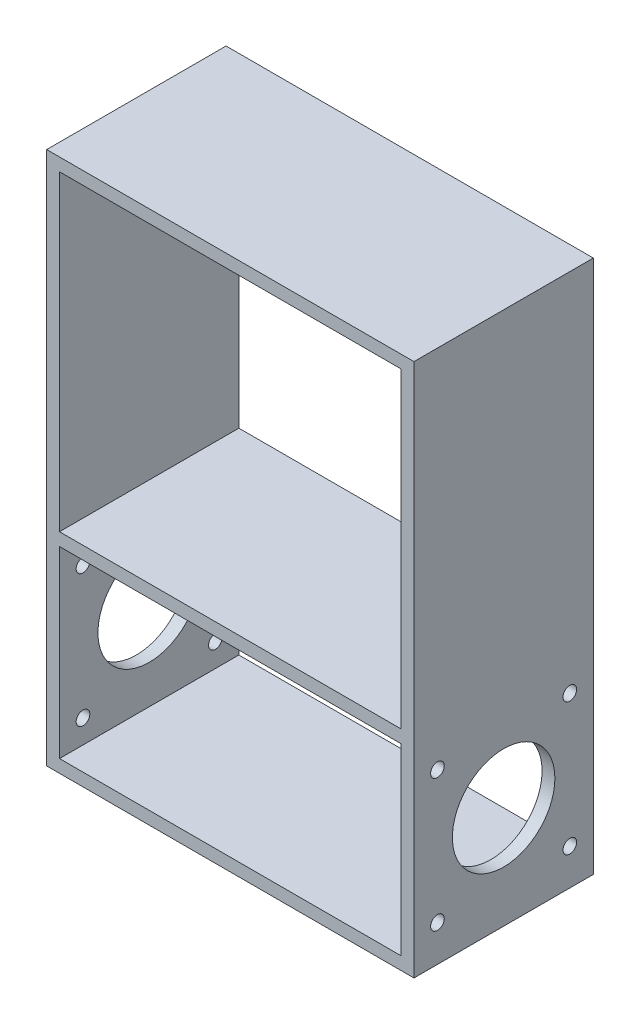
ISO-10303-21;
HEADER;
FILE_DESCRIPTION(('STEP AP214'),'2;1');
FILE_NAME('part.step','',(''),(''),'','','');
FILE_SCHEMA(('AUTOMOTIVE_DESIGN { 1 0 10303 214 1 1 1 1 }'));
ENDSEC;
DATA;
#1=APPLICATION_CONTEXT('core data for automotive mechanical design processes');
#2=APPLICATION_PROTOCOL_DEFINITION('international standard','automotive_design',2000,#1);
#3=PRODUCT_CONTEXT('',#1,'mechanical');
#4=PRODUCT('Part','Part','',(#3));
#5=PRODUCT_RELATED_PRODUCT_CATEGORY('part','',(#4));
#6=PRODUCT_DEFINITION_FORMATION('','',#4);
#7=PRODUCT_DEFINITION_CONTEXT('part definition',#1,'design');
#8=PRODUCT_DEFINITION('design','',#6,#7);
#9=PRODUCT_DEFINITION_SHAPE('','',#8);
#10=(LENGTH_UNIT() NAMED_UNIT(*) SI_UNIT(.MILLI.,.METRE.));
#11=(NAMED_UNIT(*) PLANE_ANGLE_UNIT() SI_UNIT($,.RADIAN.));
#12=(NAMED_UNIT(*) SI_UNIT($,.STERADIAN.) SOLID_ANGLE_UNIT());
#13=UNCERTAINTY_MEASURE_WITH_UNIT(LENGTH_MEASURE(1.E-05),#10,'distance_accuracy_value','');
#14=(GEOMETRIC_REPRESENTATION_CONTEXT(3) GLOBAL_UNCERTAINTY_ASSIGNED_CONTEXT((#13)) GLOBAL_UNIT_ASSIGNED_CONTEXT((#10,
#11,#12)) REPRESENTATION_CONTEXT('',''));
#15=CARTESIAN_POINT('',(0.,0.,0.));
#16=DIRECTION('',(0.,0.,1.));
#17=DIRECTION('',(1.,0.,0.));
#18=AXIS2_PLACEMENT_3D('',#15,#16,#17);
#19=CARTESIAN_POINT('',(0.,0.,0.));
#20=DIRECTION('',(1.,0.,0.));
#21=DIRECTION('',(0.,0.,-1.));
#22=AXIS2_PLACEMENT_3D('',#19,#20,#21);
#23=PLANE('',#22);
#24=CARTESIAN_POINT('',(0.,15.5,-15.5));
#25=DIRECTION('',(1.,0.,0.));
#26=DIRECTION('',(0.,0.,-1.));
#27=AXIS2_PLACEMENT_3D('',#24,#25,#26);
#28=CIRCLE('',#27,1.6);
#29=CARTESIAN_POINT('',(0.,15.5,-17.1));
#30=VERTEX_POINT('',#29);
#31=EDGE_CURVE('E230',#30,#30,#28,.T.);
#32=ORIENTED_EDGE('',*,*,#31,.T.);
#33=EDGE_LOOP('',(#32));
#34=FACE_BOUND('',#33,.T.);
#35=CARTESIAN_POINT('',(0.,-15.5,15.5));
#36=DIRECTION('',(1.,0.,0.));
#37=DIRECTION('',(0.,0.,-1.));
#38=AXIS2_PLACEMENT_3D('',#35,#36,#37);
#39=CIRCLE('',#38,1.6);
#40=CARTESIAN_POINT('',(0.,-15.5,13.9));
#41=VERTEX_POINT('',#40);
#42=EDGE_CURVE('E233',#41,#41,#39,.T.);
#43=ORIENTED_EDGE('',*,*,#42,.T.);
#44=EDGE_LOOP('',(#43));
#45=FACE_BOUND('',#44,.T.);
#46=CARTESIAN_POINT('',(0.,15.5,15.5));
#47=DIRECTION('',(1.,0.,0.));
#48=DIRECTION('',(0.,0.,-1.));
#49=AXIS2_PLACEMENT_3D('',#46,#47,#48);
#50=CIRCLE('',#49,1.6);
#51=CARTESIAN_POINT('',(0.,15.5,13.9));
#52=VERTEX_POINT('',#51);
#53=EDGE_CURVE('E236',#52,#52,#50,.T.);
#54=ORIENTED_EDGE('',*,*,#53,.T.);
#55=EDGE_LOOP('',(#54));
#56=FACE_BOUND('',#55,.T.);
#57=CARTESIAN_POINT('',(0.,-15.5,-15.5));
#58=DIRECTION('',(1.,0.,0.));
#59=DIRECTION('',(0.,0.,-1.));
#60=AXIS2_PLACEMENT_3D('',#57,#58,#59);
#61=CIRCLE('',#60,1.60000000000001);
#62=CARTESIAN_POINT('',(0.,-15.5,-17.1));
#63=VERTEX_POINT('',#62);
#64=EDGE_CURVE('E239',#63,#63,#61,.T.);
#65=ORIENTED_EDGE('',*,*,#64,.T.);
#66=EDGE_LOOP('',(#65));
#67=FACE_BOUND('',#66,.T.);
#68=CARTESIAN_POINT('',(0.,0.,0.));
#69=DIRECTION('',(1.,0.,0.));
#70=DIRECTION('',(0.,0.,-1.));
#71=AXIS2_PLACEMENT_3D('',#68,#69,#70);
#72=CIRCLE('',#71,12.);
#73=CARTESIAN_POINT('',(0.,0.,-12.));
#74=VERTEX_POINT('',#73);
#75=EDGE_CURVE('E202',#74,#74,#72,.T.);
#76=ORIENTED_EDGE('',*,*,#75,.T.);
#77=EDGE_LOOP('',(#76));
#78=FACE_BOUND('',#77,.T.);
#79=DIRECTION('',(0.,1.,0.));
#80=VECTOR('',#79,1.);
#81=CARTESIAN_POINT('',(0.,0.,-21.));
#82=LINE('',#81,#80);
#83=CARTESIAN_POINT('',(0.,-21.,-21.));
#84=VERTEX_POINT('',#83);
#85=CARTESIAN_POINT('',(0.,22.,-21.));
#86=VERTEX_POINT('',#85);
#87=EDGE_CURVE('E228',#84,#86,#82,.T.);
#88=ORIENTED_EDGE('',*,*,#87,.F.);
#89=DIRECTION('',(0.,0.,1.));
#90=VECTOR('',#89,1.);
#91=CARTESIAN_POINT('',(0.,-21.,0.));
#92=LINE('',#91,#90);
#93=CARTESIAN_POINT('',(0.,-21.,21.));
#94=VERTEX_POINT('',#93);
#95=EDGE_CURVE('E52',#84,#94,#92,.T.);
#96=ORIENTED_EDGE('',*,*,#95,.T.);
#97=DIRECTION('',(0.,1.,0.));
#98=VECTOR('',#97,1.);
#99=CARTESIAN_POINT('',(0.,0.,21.));
#100=LINE('',#99,#98);
#101=CARTESIAN_POINT('',(0.,22.,21.));
#102=VERTEX_POINT('',#101);
#103=EDGE_CURVE('E131',#94,#102,#100,.T.);
#104=ORIENTED_EDGE('',*,*,#103,.T.);
#105=DIRECTION('',(0.,0.,1.));
#106=VECTOR('',#105,1.);
#107=CARTESIAN_POINT('',(0.,22.,0.));
#108=LINE('',#107,#106);
#109=EDGE_CURVE('E176',#86,#102,#108,.T.);
#110=ORIENTED_EDGE('',*,*,#109,.F.);
#111=EDGE_LOOP('',(#88,#96,#104,#110));
#112=FACE_BOUND('',#111,.T.);
#113=ADVANCED_FACE('F37',(#34,#45,#56,#67,#78,#112),#23,.F.);
#114=CARTESIAN_POINT('',(0.,25.,-21.));
#115=VERTEX_POINT('',#114);
#116=CARTESIAN_POINT('',(0.,98.,-21.));
#117=VERTEX_POINT('',#116);
#118=EDGE_CURVE('E227',#115,#117,#82,.T.);
#119=ORIENTED_EDGE('',*,*,#118,.F.);
#120=DIRECTION('',(0.,0.,1.));
#121=VECTOR('',#120,1.);
#122=CARTESIAN_POINT('',(0.,25.,0.));
#123=LINE('',#122,#121);
#124=CARTESIAN_POINT('',(0.,25.,21.));
#125=VERTEX_POINT('',#124);
#126=EDGE_CURVE('E60',#115,#125,#123,.T.);
#127=ORIENTED_EDGE('',*,*,#126,.T.);
#128=CARTESIAN_POINT('',(0.,98.,21.));
#129=VERTEX_POINT('',#128);
#130=EDGE_CURVE('E197',#125,#129,#100,.T.);
#131=ORIENTED_EDGE('',*,*,#130,.T.);
#132=DIRECTION('',(0.,0.,1.));
#133=VECTOR('',#132,1.);
#134=CARTESIAN_POINT('',(0.,98.,0.));
#135=LINE('',#134,#133);
#136=EDGE_CURVE('E188',#117,#129,#135,.T.);
#137=ORIENTED_EDGE('',*,*,#136,.F.);
#138=EDGE_LOOP('',(#119,#127,#131,#137));
#139=FACE_BOUND('',#138,.T.);
#140=ADVANCED_FACE('F312',(#139),#23,.F.);
#141=CARTESIAN_POINT('',(3.,0.,21.));
#142=DIRECTION('',(0.,0.,1.));
#143=DIRECTION('',(1.,0.,0.));
#144=AXIS2_PLACEMENT_3D('',#141,#142,#143);
#145=PLANE('',#144);
#146=DIRECTION('',(-1.,0.,0.));
#147=VECTOR('',#146,1.);
#148=CARTESIAN_POINT('',(3.,101.,21.));
#149=LINE('',#148,#147);
#150=CARTESIAN_POINT('',(3.,101.,21.));
#151=VERTEX_POINT('',#150);
#152=CARTESIAN_POINT('',(-83.,101.,21.));
#153=VERTEX_POINT('',#152);
#154=EDGE_CURVE('E225',#151,#153,#149,.T.);
#155=ORIENTED_EDGE('',*,*,#154,.T.);
#156=DIRECTION('',(0.,1.,0.));
#157=VECTOR('',#156,1.);
#158=CARTESIAN_POINT('',(-83.,0.,21.));
#159=LINE('',#158,#157);
#160=CARTESIAN_POINT('',(-83.,-24.,21.));
#161=VERTEX_POINT('',#160);
#162=EDGE_CURVE('E172',#161,#153,#159,.T.);
#163=ORIENTED_EDGE('',*,*,#162,.F.);
#164=DIRECTION('',(-1.,0.,0.));
#165=VECTOR('',#164,1.);
#166=CARTESIAN_POINT('',(3.,-24.,21.));
#167=LINE('',#166,#165);
#168=CARTESIAN_POINT('',(3.,-24.,21.));
#169=VERTEX_POINT('',#168);
#170=EDGE_CURVE('E11',#169,#161,#167,.T.);
#171=ORIENTED_EDGE('',*,*,#170,.F.);
#172=DIRECTION('',(0.,1.,0.));
#173=VECTOR('',#172,1.);
#174=CARTESIAN_POINT('',(3.,0.,21.));
#175=LINE('',#174,#173);
#176=EDGE_CURVE('E198',#169,#151,#175,.T.);
#177=ORIENTED_EDGE('',*,*,#176,.T.);
#178=EDGE_LOOP('',(#155,#163,#171,#177));
#179=FACE_BOUND('',#178,.T.);
#180=DIRECTION('',(1.,0.,0.));
#181=VECTOR('',#180,1.);
#182=CARTESIAN_POINT('',(-40.,25.,21.));
#183=LINE('',#182,#181);
#184=CARTESIAN_POINT('',(-80.,25.,21.));
#185=VERTEX_POINT('',#184);
#186=EDGE_CURVE('E179',#185,#125,#183,.T.);
#187=ORIENTED_EDGE('',*,*,#186,.F.);
#188=DIRECTION('',(0.,1.,0.));
#189=VECTOR('',#188,1.);
#190=CARTESIAN_POINT('',(-80.,0.,21.));
#191=LINE('',#190,#189);
#192=CARTESIAN_POINT('',(-80.,98.,21.));
#193=VERTEX_POINT('',#192);
#194=EDGE_CURVE('E146',#185,#193,#191,.T.);
#195=ORIENTED_EDGE('',*,*,#194,.T.);
#196=DIRECTION('',(1.,0.,0.));
#197=VECTOR('',#196,1.);
#198=CARTESIAN_POINT('',(-40.,98.,21.));
#199=LINE('',#198,#197);
#200=EDGE_CURVE('E191',#193,#129,#199,.T.);
#201=ORIENTED_EDGE('',*,*,#200,.T.);
#202=ORIENTED_EDGE('',*,*,#130,.F.);
#203=EDGE_LOOP('',(#187,#195,#201,#202));
#204=FACE_BOUND('',#203,.T.);
#205=ORIENTED_EDGE('',*,*,#103,.F.);
#206=DIRECTION('',(1.,0.,0.));
#207=VECTOR('',#206,1.);
#208=CARTESIAN_POINT('',(-40.,-21.,21.));
#209=LINE('',#208,#207);
#210=CARTESIAN_POINT('',(-80.,-21.,21.));
#211=VERTEX_POINT('',#210);
#212=EDGE_CURVE('E125',#211,#94,#209,.T.);
#213=ORIENTED_EDGE('',*,*,#212,.F.);
#214=CARTESIAN_POINT('',(-80.,22.,21.));
#215=VERTEX_POINT('',#214);
#216=EDGE_CURVE('E129',#211,#215,#191,.T.);
#217=ORIENTED_EDGE('',*,*,#216,.T.);
#218=DIRECTION('',(1.,0.,0.));
#219=VECTOR('',#218,1.);
#220=CARTESIAN_POINT('',(-40.,22.,21.));
#221=LINE('',#220,#219);
#222=EDGE_CURVE('E181',#215,#102,#221,.T.);
#223=ORIENTED_EDGE('',*,*,#222,.T.);
#224=EDGE_LOOP('',(#205,#213,#217,#223));
#225=FACE_BOUND('',#224,.T.);
#226=ADVANCED_FACE('F39',(#179,#204,#225),#145,.T.);
#227=CARTESIAN_POINT('',(3.,-24.,0.));
#228=DIRECTION('',(0.,-1.,0.));
#229=DIRECTION('',(0.,0.,-1.));
#230=AXIS2_PLACEMENT_3D('',#227,#228,#229);
#231=PLANE('',#230);
#232=ORIENTED_EDGE('',*,*,#170,.T.);
#233=DIRECTION('',(0.,0.,1.));
#234=VECTOR('',#233,1.);
#235=CARTESIAN_POINT('',(-83.,-24.,0.));
#236=LINE('',#235,#234);
#237=CARTESIAN_POINT('',(-83.,-24.,-21.));
#238=VERTEX_POINT('',#237);
#239=EDGE_CURVE('E262',#238,#161,#236,.T.);
#240=ORIENTED_EDGE('',*,*,#239,.F.);
#241=DIRECTION('',(-1.,0.,0.));
#242=VECTOR('',#241,1.);
#243=CARTESIAN_POINT('',(3.,-24.,-21.));
#244=LINE('',#243,#242);
#245=CARTESIAN_POINT('',(3.,-24.,-21.));
#246=VERTEX_POINT('',#245);
#247=EDGE_CURVE('E45',#246,#238,#244,.T.);
#248=ORIENTED_EDGE('',*,*,#247,.F.);
#249=DIRECTION('',(0.,0.,1.));
#250=VECTOR('',#249,1.);
#251=CARTESIAN_POINT('',(3.,-24.,0.));
#252=LINE('',#251,#250);
#253=EDGE_CURVE('E201',#246,#169,#252,.T.);
#254=ORIENTED_EDGE('',*,*,#253,.T.);
#255=EDGE_LOOP('',(#232,#240,#248,#254));
#256=FACE_BOUND('',#255,.T.);
#257=ADVANCED_FACE('F267',(#256),#231,.T.);
#258=CARTESIAN_POINT('',(3.,0.,-21.));
#259=DIRECTION('',(0.,0.,1.));
#260=DIRECTION('',(0.,-1.,0.));
#261=AXIS2_PLACEMENT_3D('',#258,#259,#260);
#262=PLANE('',#261);
#263=DIRECTION('',(1.,0.,0.));
#264=VECTOR('',#263,1.);
#265=CARTESIAN_POINT('',(-40.,98.,-21.));
#266=LINE('',#265,#264);
#267=CARTESIAN_POINT('',(-80.,98.,-21.));
#268=VERTEX_POINT('',#267);
#269=EDGE_CURVE('E194',#268,#117,#266,.T.);
#270=ORIENTED_EDGE('',*,*,#269,.F.);
#271=DIRECTION('',(0.,1.,0.));
#272=VECTOR('',#271,1.);
#273=CARTESIAN_POINT('',(-80.,0.,-21.));
#274=LINE('',#273,#272);
#275=CARTESIAN_POINT('',(-80.,25.,-21.));
#276=VERTEX_POINT('',#275);
#277=EDGE_CURVE('E145',#276,#268,#274,.T.);
#278=ORIENTED_EDGE('',*,*,#277,.F.);
#279=DIRECTION('',(1.,0.,0.));
#280=VECTOR('',#279,1.);
#281=CARTESIAN_POINT('',(-40.,25.,-21.));
#282=LINE('',#281,#280);
#283=EDGE_CURVE('E186',#276,#115,#282,.T.);
#284=ORIENTED_EDGE('',*,*,#283,.T.);
#285=ORIENTED_EDGE('',*,*,#118,.T.);
#286=EDGE_LOOP('',(#270,#278,#284,#285));
#287=FACE_BOUND('',#286,.T.);
#288=DIRECTION('',(1.,0.,0.));
#289=VECTOR('',#288,1.);
#290=CARTESIAN_POINT('',(-40.,22.,-21.));
#291=LINE('',#290,#289);
#292=CARTESIAN_POINT('',(-80.,22.,-21.));
#293=VERTEX_POINT('',#292);
#294=EDGE_CURVE('E183',#293,#86,#291,.T.);
#295=ORIENTED_EDGE('',*,*,#294,.F.);
#296=CARTESIAN_POINT('',(-80.,-21.,-21.));
#297=VERTEX_POINT('',#296);
#298=EDGE_CURVE('E149',#297,#293,#274,.T.);
#299=ORIENTED_EDGE('',*,*,#298,.F.);
#300=DIRECTION('',(1.,0.,0.));
#301=VECTOR('',#300,1.);
#302=CARTESIAN_POINT('',(-40.,-21.,-21.));
#303=LINE('',#302,#301);
#304=EDGE_CURVE('E132',#297,#84,#303,.T.);
#305=ORIENTED_EDGE('',*,*,#304,.T.);
#306=ORIENTED_EDGE('',*,*,#87,.T.);
#307=EDGE_LOOP('',(#295,#299,#305,#306));
#308=FACE_BOUND('',#307,.T.);
#309=ORIENTED_EDGE('',*,*,#247,.T.);
#310=DIRECTION('',(0.,1.,0.));
#311=VECTOR('',#310,1.);
#312=CARTESIAN_POINT('',(-83.,0.,-21.));
#313=LINE('',#312,#311);
#314=CARTESIAN_POINT('',(-83.,101.,-21.));
#315=VERTEX_POINT('',#314);
#316=EDGE_CURVE('E252',#238,#315,#313,.T.);
#317=ORIENTED_EDGE('',*,*,#316,.T.);
#318=DIRECTION('',(-1.,0.,0.));
#319=VECTOR('',#318,1.);
#320=CARTESIAN_POINT('',(3.,101.,-21.));
#321=LINE('',#320,#319);
#322=CARTESIAN_POINT('',(3.,101.,-21.));
#323=VERTEX_POINT('',#322);
#324=EDGE_CURVE('E245',#323,#315,#321,.T.);
#325=ORIENTED_EDGE('',*,*,#324,.F.);
#326=DIRECTION('',(0.,1.,0.));
#327=VECTOR('',#326,1.);
#328=CARTESIAN_POINT('',(3.,0.,-21.));
#329=LINE('',#328,#327);
#330=EDGE_CURVE('E205',#246,#323,#329,.T.);
#331=ORIENTED_EDGE('',*,*,#330,.F.);
#332=EDGE_LOOP('',(#309,#317,#325,#331));
#333=FACE_BOUND('',#332,.T.);
#334=ADVANCED_FACE('F250',(#287,#308,#333),#262,.F.);
#335=CARTESIAN_POINT('',(3.,-15.5,-15.5));
#336=DIRECTION('',(-1.,0.,0.));
#337=DIRECTION('',(0.,0.,1.));
#338=AXIS2_PLACEMENT_3D('',#335,#336,#337);
#339=CYLINDRICAL_SURFACE('',#338,1.60000000000001);
#340=CARTESIAN_POINT('',(3.,-15.5,-15.5));
#341=DIRECTION('',(1.,0.,0.));
#342=DIRECTION('',(0.,0.,-1.));
#343=AXIS2_PLACEMENT_3D('',#340,#341,#342);
#344=CIRCLE('',#343,1.60000000000001);
#345=CARTESIAN_POINT('',(3.,-15.5,-17.1));
#346=VERTEX_POINT('',#345);
#347=EDGE_CURVE('E219',#346,#346,#344,.T.);
#348=ORIENTED_EDGE('',*,*,#347,.T.);
#349=EDGE_LOOP('',(#348));
#350=FACE_BOUND('',#349,.T.);
#351=ORIENTED_EDGE('',*,*,#64,.F.);
#352=EDGE_LOOP('',(#351));
#353=FACE_BOUND('',#352,.T.);
#354=ADVANCED_FACE('F329',(#350,#353),#339,.F.);
#355=CARTESIAN_POINT('',(3.,15.5,15.5));
#356=DIRECTION('',(-1.,0.,0.));
#357=DIRECTION('',(0.,0.,1.));
#358=AXIS2_PLACEMENT_3D('',#355,#356,#357);
#359=CYLINDRICAL_SURFACE('',#358,1.6);
#360=CARTESIAN_POINT('',(3.,15.5,15.5));
#361=DIRECTION('',(1.,0.,0.));
#362=DIRECTION('',(0.,0.,-1.));
#363=AXIS2_PLACEMENT_3D('',#360,#361,#362);
#364=CIRCLE('',#363,1.6);
#365=CARTESIAN_POINT('',(3.,15.5,13.9));
#366=VERTEX_POINT('',#365);
#367=EDGE_CURVE('E216',#366,#366,#364,.T.);
#368=ORIENTED_EDGE('',*,*,#367,.T.);
#369=EDGE_LOOP('',(#368));
#370=FACE_BOUND('',#369,.T.);
#371=ORIENTED_EDGE('',*,*,#53,.F.);
#372=EDGE_LOOP('',(#371));
#373=FACE_BOUND('',#372,.T.);
#374=ADVANCED_FACE('F332',(#370,#373),#359,.F.);
#375=CARTESIAN_POINT('',(3.,-15.5,15.5));
#376=DIRECTION('',(-1.,0.,0.));
#377=DIRECTION('',(0.,0.,1.));
#378=AXIS2_PLACEMENT_3D('',#375,#376,#377);
#379=CYLINDRICAL_SURFACE('',#378,1.6);
#380=CARTESIAN_POINT('',(3.,-15.5,15.5));
#381=DIRECTION('',(1.,0.,0.));
#382=DIRECTION('',(0.,0.,-1.));
#383=AXIS2_PLACEMENT_3D('',#380,#381,#382);
#384=CIRCLE('',#383,1.6);
#385=CARTESIAN_POINT('',(3.,-15.5,13.9));
#386=VERTEX_POINT('',#385);
#387=EDGE_CURVE('E213',#386,#386,#384,.T.);
#388=ORIENTED_EDGE('',*,*,#387,.T.);
#389=EDGE_LOOP('',(#388));
#390=FACE_BOUND('',#389,.T.);
#391=ORIENTED_EDGE('',*,*,#42,.F.);
#392=EDGE_LOOP('',(#391));
#393=FACE_BOUND('',#392,.T.);
#394=ADVANCED_FACE('F336',(#390,#393),#379,.F.);
#395=CARTESIAN_POINT('',(3.,15.5,-15.5));
#396=DIRECTION('',(-1.,0.,0.));
#397=DIRECTION('',(0.,0.,1.));
#398=AXIS2_PLACEMENT_3D('',#395,#396,#397);
#399=CYLINDRICAL_SURFACE('',#398,1.6);
#400=CARTESIAN_POINT('',(3.,15.5,-15.5));
#401=DIRECTION('',(1.,0.,0.));
#402=DIRECTION('',(0.,0.,-1.));
#403=AXIS2_PLACEMENT_3D('',#400,#401,#402);
#404=CIRCLE('',#403,1.6);
#405=CARTESIAN_POINT('',(3.,15.5,-17.1));
#406=VERTEX_POINT('',#405);
#407=EDGE_CURVE('E210',#406,#406,#404,.T.);
#408=ORIENTED_EDGE('',*,*,#407,.T.);
#409=EDGE_LOOP('',(#408));
#410=FACE_BOUND('',#409,.T.);
#411=ORIENTED_EDGE('',*,*,#31,.F.);
#412=EDGE_LOOP('',(#411));
#413=FACE_BOUND('',#412,.T.);
#414=ADVANCED_FACE('F340',(#410,#413),#399,.F.);
#415=CARTESIAN_POINT('',(3.,101.,0.));
#416=DIRECTION('',(0.,1.,0.));
#417=DIRECTION('',(0.,0.,1.));
#418=AXIS2_PLACEMENT_3D('',#415,#416,#417);
#419=PLANE('',#418);
#420=ORIENTED_EDGE('',*,*,#324,.T.);
#421=DIRECTION('',(0.,0.,-1.));
#422=VECTOR('',#421,1.);
#423=CARTESIAN_POINT('',(-83.,101.,0.));
#424=LINE('',#423,#422);
#425=EDGE_CURVE('E265',#153,#315,#424,.T.);
#426=ORIENTED_EDGE('',*,*,#425,.F.);
#427=ORIENTED_EDGE('',*,*,#154,.F.);
#428=DIRECTION('',(0.,0.,-1.));
#429=VECTOR('',#428,1.);
#430=CARTESIAN_POINT('',(3.,101.,0.));
#431=LINE('',#430,#429);
#432=EDGE_CURVE('E207',#151,#323,#431,.T.);
#433=ORIENTED_EDGE('',*,*,#432,.T.);
#434=EDGE_LOOP('',(#420,#426,#427,#433));
#435=FACE_BOUND('',#434,.T.);
#436=ADVANCED_FACE('F327',(#435),#419,.T.);
#437=CARTESIAN_POINT('',(3.,0.,0.));
#438=DIRECTION('',(-1.,0.,0.));
#439=DIRECTION('',(0.,0.,1.));
#440=AXIS2_PLACEMENT_3D('',#437,#438,#439);
#441=CYLINDRICAL_SURFACE('',#440,12.);
#442=CARTESIAN_POINT('',(3.,0.,0.));
#443=DIRECTION('',(1.,0.,0.));
#444=DIRECTION('',(0.,0.,-1.));
#445=AXIS2_PLACEMENT_3D('',#442,#443,#444);
#446=CIRCLE('',#445,12.);
#447=CARTESIAN_POINT('',(3.,0.,-12.));
#448=VERTEX_POINT('',#447);
#449=EDGE_CURVE('E222',#448,#448,#446,.T.);
#450=ORIENTED_EDGE('',*,*,#449,.T.);
#451=EDGE_LOOP('',(#450));
#452=FACE_BOUND('',#451,.T.);
#453=ORIENTED_EDGE('',*,*,#75,.F.);
#454=EDGE_LOOP('',(#453));
#455=FACE_BOUND('',#454,.T.);
#456=ADVANCED_FACE('F324',(#452,#455),#441,.F.);
#457=CARTESIAN_POINT('',(3.,0.,0.));
#458=DIRECTION('',(1.,0.,0.));
#459=DIRECTION('',(0.,0.,-1.));
#460=AXIS2_PLACEMENT_3D('',#457,#458,#459);
#461=PLANE('',#460);
#462=ORIENTED_EDGE('',*,*,#176,.F.);
#463=ORIENTED_EDGE('',*,*,#253,.F.);
#464=ORIENTED_EDGE('',*,*,#330,.T.);
#465=ORIENTED_EDGE('',*,*,#432,.F.);
#466=EDGE_LOOP('',(#462,#463,#464,#465));
#467=FACE_BOUND('',#466,.T.);
#468=ORIENTED_EDGE('',*,*,#407,.F.);
#469=EDGE_LOOP('',(#468));
#470=FACE_BOUND('',#469,.T.);
#471=ORIENTED_EDGE('',*,*,#387,.F.);
#472=EDGE_LOOP('',(#471));
#473=FACE_BOUND('',#472,.T.);
#474=ORIENTED_EDGE('',*,*,#367,.F.);
#475=EDGE_LOOP('',(#474));
#476=FACE_BOUND('',#475,.T.);
#477=ORIENTED_EDGE('',*,*,#347,.F.);
#478=EDGE_LOOP('',(#477));
#479=FACE_BOUND('',#478,.T.);
#480=ORIENTED_EDGE('',*,*,#449,.F.);
#481=EDGE_LOOP('',(#480));
#482=FACE_BOUND('',#481,.T.);
#483=ADVANCED_FACE('F322',(#467,#470,#473,#476,#479,#482),#461,.T.);
#484=CARTESIAN_POINT('',(-40.,98.,0.));
#485=DIRECTION('',(0.,1.,0.));
#486=DIRECTION('',(0.,0.,1.));
#487=AXIS2_PLACEMENT_3D('',#484,#485,#486);
#488=PLANE('',#487);
#489=ORIENTED_EDGE('',*,*,#136,.T.);
#490=ORIENTED_EDGE('',*,*,#200,.F.);
#491=DIRECTION('',(0.,0.,1.));
#492=VECTOR('',#491,1.);
#493=CARTESIAN_POINT('',(-80.,98.,0.));
#494=LINE('',#493,#492);
#495=EDGE_CURVE('E152',#268,#193,#494,.T.);
#496=ORIENTED_EDGE('',*,*,#495,.F.);
#497=ORIENTED_EDGE('',*,*,#269,.T.);
#498=EDGE_LOOP('',(#489,#490,#496,#497));
#499=FACE_BOUND('',#498,.T.);
#500=ADVANCED_FACE('F369',(#499),#488,.F.);
#501=CARTESIAN_POINT('',(-40.,25.,0.));
#502=DIRECTION('',(0.,1.,0.));
#503=DIRECTION('',(0.,0.,1.));
#504=AXIS2_PLACEMENT_3D('',#501,#502,#503);
#505=PLANE('',#504);
#506=ORIENTED_EDGE('',*,*,#126,.F.);
#507=ORIENTED_EDGE('',*,*,#283,.F.);
#508=DIRECTION('',(0.,0.,1.));
#509=VECTOR('',#508,1.);
#510=CARTESIAN_POINT('',(-80.,25.,0.));
#511=LINE('',#510,#509);
#512=EDGE_CURVE('E140',#276,#185,#511,.T.);
#513=ORIENTED_EDGE('',*,*,#512,.T.);
#514=ORIENTED_EDGE('',*,*,#186,.T.);
#515=EDGE_LOOP('',(#506,#507,#513,#514));
#516=FACE_BOUND('',#515,.T.);
#517=ADVANCED_FACE('F363',(#516),#505,.T.);
#518=CARTESIAN_POINT('',(-40.,22.,0.));
#519=DIRECTION('',(0.,1.,0.));
#520=DIRECTION('',(0.,0.,1.));
#521=AXIS2_PLACEMENT_3D('',#518,#519,#520);
#522=PLANE('',#521);
#523=ORIENTED_EDGE('',*,*,#109,.T.);
#524=ORIENTED_EDGE('',*,*,#222,.F.);
#525=DIRECTION('',(0.,0.,1.));
#526=VECTOR('',#525,1.);
#527=CARTESIAN_POINT('',(-80.,22.,0.));
#528=LINE('',#527,#526);
#529=EDGE_CURVE('E144',#293,#215,#528,.T.);
#530=ORIENTED_EDGE('',*,*,#529,.F.);
#531=ORIENTED_EDGE('',*,*,#294,.T.);
#532=EDGE_LOOP('',(#523,#524,#530,#531));
#533=FACE_BOUND('',#532,.T.);
#534=ADVANCED_FACE('F306',(#533),#522,.F.);
#535=CARTESIAN_POINT('',(-40.,-21.,0.));
#536=DIRECTION('',(0.,1.,0.));
#537=DIRECTION('',(0.,0.,1.));
#538=AXIS2_PLACEMENT_3D('',#535,#536,#537);
#539=PLANE('',#538);
#540=ORIENTED_EDGE('',*,*,#95,.F.);
#541=ORIENTED_EDGE('',*,*,#304,.F.);
#542=DIRECTION('',(0.,0.,1.));
#543=VECTOR('',#542,1.);
#544=CARTESIAN_POINT('',(-80.,-21.,0.));
#545=LINE('',#544,#543);
#546=EDGE_CURVE('E135',#297,#211,#545,.T.);
#547=ORIENTED_EDGE('',*,*,#546,.T.);
#548=ORIENTED_EDGE('',*,*,#212,.T.);
#549=EDGE_LOOP('',(#540,#541,#547,#548));
#550=FACE_BOUND('',#549,.T.);
#551=ADVANCED_FACE('F136',(#550),#539,.T.);
#552=CARTESIAN_POINT('',(-80.,0.,0.));
#553=DIRECTION('',(-1.,0.,0.));
#554=DIRECTION('',(0.,0.,-1.));
#555=AXIS2_PLACEMENT_3D('',#552,#553,#554);
#556=PLANE('',#555);
#557=CARTESIAN_POINT('',(-80.,15.5,-15.5));
#558=DIRECTION('',(1.,0.,0.));
#559=DIRECTION('',(0.,0.,-1.));
#560=AXIS2_PLACEMENT_3D('',#557,#558,#559);
#561=CIRCLE('',#560,1.6);
#562=CARTESIAN_POINT('',(-80.,15.5,-17.1));
#563=VERTEX_POINT('',#562);
#564=EDGE_CURVE('E157',#563,#563,#561,.T.);
#565=ORIENTED_EDGE('',*,*,#564,.F.);
#566=EDGE_LOOP('',(#565));
#567=FACE_BOUND('',#566,.T.);
#568=CARTESIAN_POINT('',(-80.,-15.5,15.5));
#569=DIRECTION('',(1.,0.,0.));
#570=DIRECTION('',(0.,0.,-1.));
#571=AXIS2_PLACEMENT_3D('',#568,#569,#570);
#572=CIRCLE('',#571,1.6);
#573=CARTESIAN_POINT('',(-80.,-15.5,13.9));
#574=VERTEX_POINT('',#573);
#575=EDGE_CURVE('E160',#574,#574,#572,.T.);
#576=ORIENTED_EDGE('',*,*,#575,.F.);
#577=EDGE_LOOP('',(#576));
#578=FACE_BOUND('',#577,.T.);
#579=CARTESIAN_POINT('',(-80.,15.5,15.5));
#580=DIRECTION('',(1.,0.,0.));
#581=DIRECTION('',(0.,0.,-1.));
#582=AXIS2_PLACEMENT_3D('',#579,#580,#581);
#583=CIRCLE('',#582,1.6);
#584=CARTESIAN_POINT('',(-80.,15.5,13.9));
#585=VERTEX_POINT('',#584);
#586=EDGE_CURVE('E163',#585,#585,#583,.T.);
#587=ORIENTED_EDGE('',*,*,#586,.F.);
#588=EDGE_LOOP('',(#587));
#589=FACE_BOUND('',#588,.T.);
#590=CARTESIAN_POINT('',(-80.,-15.5,-15.5));
#591=DIRECTION('',(1.,0.,0.));
#592=DIRECTION('',(0.,0.,-1.));
#593=AXIS2_PLACEMENT_3D('',#590,#591,#592);
#594=CIRCLE('',#593,1.60000000000001);
#595=CARTESIAN_POINT('',(-80.,-15.5,-17.1));
#596=VERTEX_POINT('',#595);
#597=EDGE_CURVE('E166',#596,#596,#594,.T.);
#598=ORIENTED_EDGE('',*,*,#597,.F.);
#599=EDGE_LOOP('',(#598));
#600=FACE_BOUND('',#599,.T.);
#601=CARTESIAN_POINT('',(-80.,0.,0.));
#602=DIRECTION('',(1.,0.,0.));
#603=DIRECTION('',(0.,0.,-1.));
#604=AXIS2_PLACEMENT_3D('',#601,#602,#603);
#605=CIRCLE('',#604,12.);
#606=CARTESIAN_POINT('',(-80.,0.,-12.));
#607=VERTEX_POINT('',#606);
#608=EDGE_CURVE('E169',#607,#607,#605,.T.);
#609=ORIENTED_EDGE('',*,*,#608,.F.);
#610=EDGE_LOOP('',(#609));
#611=FACE_BOUND('',#610,.T.);
#612=ORIENTED_EDGE('',*,*,#298,.T.);
#613=ORIENTED_EDGE('',*,*,#529,.T.);
#614=ORIENTED_EDGE('',*,*,#216,.F.);
#615=ORIENTED_EDGE('',*,*,#546,.F.);
#616=EDGE_LOOP('',(#612,#613,#614,#615));
#617=FACE_BOUND('',#616,.T.);
#618=ADVANCED_FACE('F142',(#567,#578,#589,#600,#611,#617),#556,.F.);
#619=ORIENTED_EDGE('',*,*,#277,.T.);
#620=ORIENTED_EDGE('',*,*,#495,.T.);
#621=ORIENTED_EDGE('',*,*,#194,.F.);
#622=ORIENTED_EDGE('',*,*,#512,.F.);
#623=EDGE_LOOP('',(#619,#620,#621,#622));
#624=FACE_BOUND('',#623,.T.);
#625=ADVANCED_FACE('F297',(#624),#556,.F.);
#626=CARTESIAN_POINT('',(-83.,-15.5,-15.5));
#627=DIRECTION('',(1.,0.,0.));
#628=DIRECTION('',(0.,0.,1.));
#629=AXIS2_PLACEMENT_3D('',#626,#627,#628);
#630=CYLINDRICAL_SURFACE('',#629,1.60000000000001);
#631=CARTESIAN_POINT('',(-83.,-15.5,-15.5));
#632=DIRECTION('',(1.,0.,0.));
#633=DIRECTION('',(0.,0.,-1.));
#634=AXIS2_PLACEMENT_3D('',#631,#632,#633);
#635=CIRCLE('',#634,1.60000000000001);
#636=CARTESIAN_POINT('',(-83.,-15.5,-17.1));
#637=VERTEX_POINT('',#636);
#638=EDGE_CURVE('E281',#637,#637,#635,.T.);
#639=ORIENTED_EDGE('',*,*,#638,.F.);
#640=EDGE_LOOP('',(#639));
#641=FACE_BOUND('',#640,.T.);
#642=ORIENTED_EDGE('',*,*,#597,.T.);
#643=EDGE_LOOP('',(#642));
#644=FACE_BOUND('',#643,.T.);
#645=ADVANCED_FACE('F304',(#641,#644),#630,.F.);
#646=CARTESIAN_POINT('',(-83.,15.5,15.5));
#647=DIRECTION('',(1.,0.,0.));
#648=DIRECTION('',(0.,0.,1.));
#649=AXIS2_PLACEMENT_3D('',#646,#647,#648);
#650=CYLINDRICAL_SURFACE('',#649,1.6);
#651=CARTESIAN_POINT('',(-83.,15.5,15.5));
#652=DIRECTION('',(1.,0.,0.));
#653=DIRECTION('',(0.,0.,-1.));
#654=AXIS2_PLACEMENT_3D('',#651,#652,#653);
#655=CIRCLE('',#654,1.6);
#656=CARTESIAN_POINT('',(-83.,15.5,13.9));
#657=VERTEX_POINT('',#656);
#658=EDGE_CURVE('E279',#657,#657,#655,.T.);
#659=ORIENTED_EDGE('',*,*,#658,.F.);
#660=EDGE_LOOP('',(#659));
#661=FACE_BOUND('',#660,.T.);
#662=ORIENTED_EDGE('',*,*,#586,.T.);
#663=EDGE_LOOP('',(#662));
#664=FACE_BOUND('',#663,.T.);
#665=ADVANCED_FACE('F589',(#661,#664),#650,.F.);
#666=CARTESIAN_POINT('',(-83.,-15.5,15.5));
#667=DIRECTION('',(1.,0.,0.));
#668=DIRECTION('',(0.,0.,1.));
#669=AXIS2_PLACEMENT_3D('',#666,#667,#668);
#670=CYLINDRICAL_SURFACE('',#669,1.6);
#671=CARTESIAN_POINT('',(-83.,-15.5,15.5));
#672=DIRECTION('',(1.,0.,0.));
#673=DIRECTION('',(0.,0.,-1.));
#674=AXIS2_PLACEMENT_3D('',#671,#672,#673);
#675=CIRCLE('',#674,1.6);
#676=CARTESIAN_POINT('',(-83.,-15.5,13.9));
#677=VERTEX_POINT('',#676);
#678=EDGE_CURVE('E276',#677,#677,#675,.T.);
#679=ORIENTED_EDGE('',*,*,#678,.F.);
#680=EDGE_LOOP('',(#679));
#681=FACE_BOUND('',#680,.T.);
#682=ORIENTED_EDGE('',*,*,#575,.T.);
#683=EDGE_LOOP('',(#682));
#684=FACE_BOUND('',#683,.T.);
#685=ADVANCED_FACE('F598',(#681,#684),#670,.F.);
#686=CARTESIAN_POINT('',(-83.,15.5,-15.5));
#687=DIRECTION('',(1.,0.,0.));
#688=DIRECTION('',(0.,0.,1.));
#689=AXIS2_PLACEMENT_3D('',#686,#687,#688);
#690=CYLINDRICAL_SURFACE('',#689,1.6);
#691=CARTESIAN_POINT('',(-83.,15.5,-15.5));
#692=DIRECTION('',(1.,0.,0.));
#693=DIRECTION('',(0.,0.,-1.));
#694=AXIS2_PLACEMENT_3D('',#691,#692,#693);
#695=CIRCLE('',#694,1.6);
#696=CARTESIAN_POINT('',(-83.,15.5,-17.1));
#697=VERTEX_POINT('',#696);
#698=EDGE_CURVE('E273',#697,#697,#695,.T.);
#699=ORIENTED_EDGE('',*,*,#698,.F.);
#700=EDGE_LOOP('',(#699));
#701=FACE_BOUND('',#700,.T.);
#702=ORIENTED_EDGE('',*,*,#564,.T.);
#703=EDGE_LOOP('',(#702));
#704=FACE_BOUND('',#703,.T.);
#705=ADVANCED_FACE('F292',(#701,#704),#690,.F.);
#706=CARTESIAN_POINT('',(-83.,0.,0.));
#707=DIRECTION('',(1.,0.,0.));
#708=DIRECTION('',(0.,0.,1.));
#709=AXIS2_PLACEMENT_3D('',#706,#707,#708);
#710=CYLINDRICAL_SURFACE('',#709,12.);
#711=CARTESIAN_POINT('',(-83.,0.,0.));
#712=DIRECTION('',(1.,0.,0.));
#713=DIRECTION('',(0.,0.,-1.));
#714=AXIS2_PLACEMENT_3D('',#711,#712,#713);
#715=CIRCLE('',#714,12.);
#716=CARTESIAN_POINT('',(-83.,0.,-12.));
#717=VERTEX_POINT('',#716);
#718=EDGE_CURVE('E154',#717,#717,#715,.T.);
#719=ORIENTED_EDGE('',*,*,#718,.F.);
#720=EDGE_LOOP('',(#719));
#721=FACE_BOUND('',#720,.T.);
#722=ORIENTED_EDGE('',*,*,#608,.T.);
#723=EDGE_LOOP('',(#722));
#724=FACE_BOUND('',#723,.T.);
#725=ADVANCED_FACE('F289',(#721,#724),#710,.F.);
#726=CARTESIAN_POINT('',(-83.,0.,0.));
#727=DIRECTION('',(-1.,0.,0.));
#728=DIRECTION('',(0.,0.,-1.));
#729=AXIS2_PLACEMENT_3D('',#726,#727,#728);
#730=PLANE('',#729);
#731=ORIENTED_EDGE('',*,*,#162,.T.);
#732=ORIENTED_EDGE('',*,*,#425,.T.);
#733=ORIENTED_EDGE('',*,*,#316,.F.);
#734=ORIENTED_EDGE('',*,*,#239,.T.);
#735=EDGE_LOOP('',(#731,#732,#733,#734));
#736=FACE_BOUND('',#735,.T.);
#737=ORIENTED_EDGE('',*,*,#698,.T.);
#738=EDGE_LOOP('',(#737));
#739=FACE_BOUND('',#738,.T.);
#740=ORIENTED_EDGE('',*,*,#678,.T.);
#741=EDGE_LOOP('',(#740));
#742=FACE_BOUND('',#741,.T.);
#743=ORIENTED_EDGE('',*,*,#658,.T.);
#744=EDGE_LOOP('',(#743));
#745=FACE_BOUND('',#744,.T.);
#746=ORIENTED_EDGE('',*,*,#638,.T.);
#747=EDGE_LOOP('',(#746));
#748=FACE_BOUND('',#747,.T.);
#749=ORIENTED_EDGE('',*,*,#718,.T.);
#750=EDGE_LOOP('',(#749));
#751=FACE_BOUND('',#750,.T.);
#752=ADVANCED_FACE('F260',(#736,#739,#742,#745,#748,#751),#730,.T.);
#753=CLOSED_SHELL('',(#113,#140,#226,#257,#334,#354,#374,#394,#414,#436,#456,#483,#500,#517,
#534,#551,#618,#625,#645,#665,#685,#705,#725,#752));
#754=MANIFOLD_SOLID_BREP('B2',#753);
#755=ADVANCED_BREP_SHAPE_REPRESENTATION('',(#18,#754),#14);
#756=SHAPE_DEFINITION_REPRESENTATION(#9,#755);
ENDSEC;
END-ISO-10303-21;
